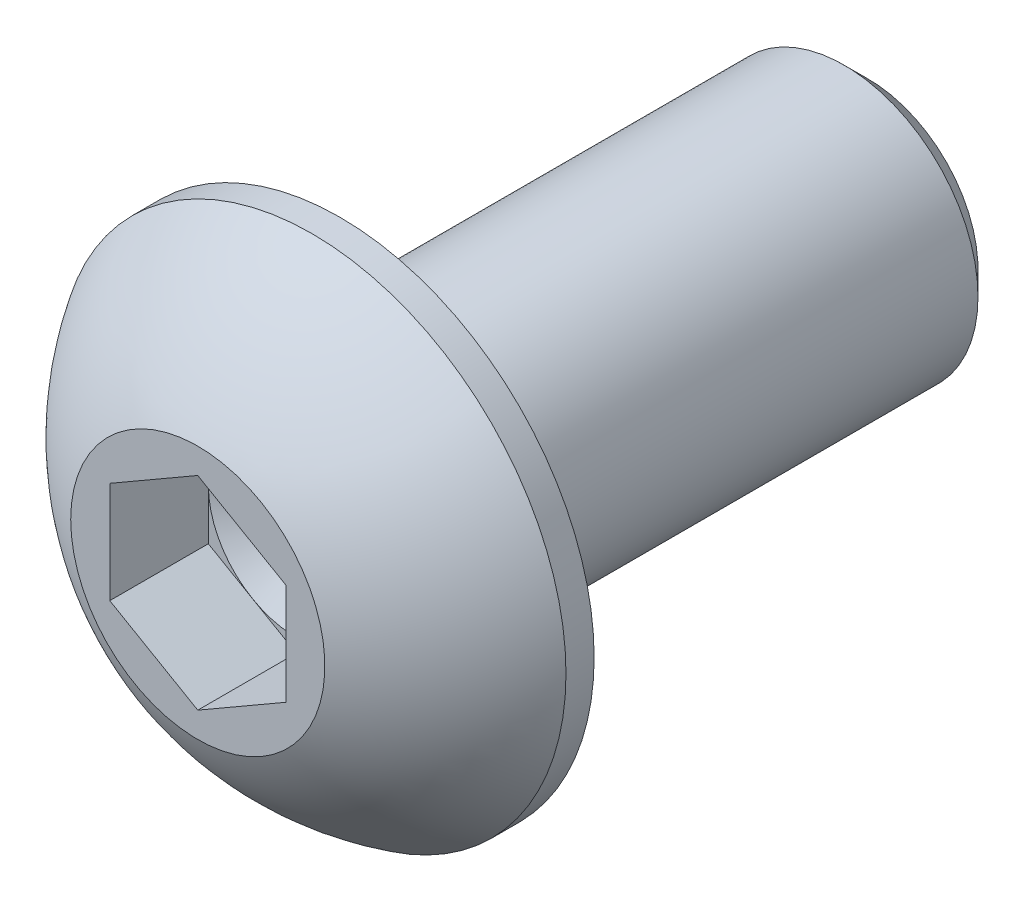
ISO-10303-21;
HEADER;
FILE_DESCRIPTION(('STEP AP214'),'2;1');
FILE_NAME('part.step','',(''),(''),'','','');
FILE_SCHEMA(('AUTOMOTIVE_DESIGN { 1 0 10303 214 1 1 1 1 }'));
ENDSEC;
DATA;
#1=APPLICATION_CONTEXT('core data for automotive mechanical design processes');
#2=APPLICATION_PROTOCOL_DEFINITION('international standard','automotive_design',2000,#1);
#3=PRODUCT_CONTEXT('',#1,'mechanical');
#4=PRODUCT('Part','Part','',(#3));
#5=PRODUCT_RELATED_PRODUCT_CATEGORY('part','',(#4));
#6=PRODUCT_DEFINITION_FORMATION('','',#4);
#7=PRODUCT_DEFINITION_CONTEXT('part definition',#1,'design');
#8=PRODUCT_DEFINITION('design','',#6,#7);
#9=PRODUCT_DEFINITION_SHAPE('','',#8);
#10=(LENGTH_UNIT() NAMED_UNIT(*) SI_UNIT(.MILLI.,.METRE.));
#11=(NAMED_UNIT(*) PLANE_ANGLE_UNIT() SI_UNIT($,.RADIAN.));
#12=(NAMED_UNIT(*) SI_UNIT($,.STERADIAN.) SOLID_ANGLE_UNIT());
#13=UNCERTAINTY_MEASURE_WITH_UNIT(LENGTH_MEASURE(1.E-05),#10,'distance_accuracy_value','');
#14=(GEOMETRIC_REPRESENTATION_CONTEXT(3) GLOBAL_UNCERTAINTY_ASSIGNED_CONTEXT((#13)) GLOBAL_UNIT_ASSIGNED_CONTEXT((#10,
#11,#12)) REPRESENTATION_CONTEXT('',''));
#15=CARTESIAN_POINT('',(0.,0.,0.));
#16=DIRECTION('',(0.,0.,1.));
#17=DIRECTION('',(1.,0.,0.));
#18=AXIS2_PLACEMENT_3D('',#15,#16,#17);
#19=CARTESIAN_POINT('',(0.,0.,-1.778));
#20=DIRECTION('',(0.,0.,1.));
#21=DIRECTION('',(1.,0.,0.));
#22=AXIS2_PLACEMENT_3D('',#19,#20,#21);
#23=PLANE('',#22);
#24=CARTESIAN_POINT('',(0.,0.,-1.778));
#25=DIRECTION('',(0.,0.,1.));
#26=DIRECTION('',(1.,0.,0.));
#27=AXIS2_PLACEMENT_3D('',#24,#25,#26);
#28=CIRCLE('',#27,1.5875);
#29=CARTESIAN_POINT('',(1.5875,0.,-1.778));
#30=VERTEX_POINT('',#29);
#31=CARTESIAN_POINT('',(0.79375,1.3748153285078,-1.778));
#32=VERTEX_POINT('',#31);
#33=EDGE_CURVE('E96',#30,#32,#28,.T.);
#34=ORIENTED_EDGE('',*,*,#33,.F.);
#35=DIRECTION('',(0.,-1.,0.));
#36=VECTOR('',#35,1.);
#37=CARTESIAN_POINT('',(1.5875,0.,-1.778));
#38=LINE('',#37,#36);
#39=CARTESIAN_POINT('',(1.5875,0.916543552338531,-1.778));
#40=VERTEX_POINT('',#39);
#41=EDGE_CURVE('E120',#40,#30,#38,.T.);
#42=ORIENTED_EDGE('',*,*,#41,.F.);
#43=DIRECTION('',(0.866025403784438,-0.5,0.));
#44=VECTOR('',#43,1.);
#45=CARTESIAN_POINT('',(0.79375,1.3748153285078,-1.778));
#46=LINE('',#45,#44);
#47=EDGE_CURVE('E118',#32,#40,#46,.T.);
#48=ORIENTED_EDGE('',*,*,#47,.F.);
#49=EDGE_LOOP('',(#34,#42,#48));
#50=FACE_BOUND('',#49,.T.);
#51=ADVANCED_FACE('F17',(#50),#23,.T.);
#52=CARTESIAN_POINT('',(-0.79375,1.37481532850779,-1.778));
#53=VERTEX_POINT('',#52);
#54=EDGE_CURVE('E98',#32,#53,#28,.T.);
#55=ORIENTED_EDGE('',*,*,#54,.F.);
#56=CARTESIAN_POINT('',(0.,1.83308710467706,-1.778));
#57=VERTEX_POINT('',#56);
#58=EDGE_CURVE('E113',#57,#32,#46,.T.);
#59=ORIENTED_EDGE('',*,*,#58,.F.);
#60=DIRECTION('',(0.866025403784437,0.5,0.));
#61=VECTOR('',#60,1.);
#62=CARTESIAN_POINT('',(-0.79375,1.37481532850779,-1.778));
#63=LINE('',#62,#61);
#64=EDGE_CURVE('E114',#53,#57,#63,.T.);
#65=ORIENTED_EDGE('',*,*,#64,.F.);
#66=EDGE_LOOP('',(#55,#59,#65));
#67=FACE_BOUND('',#66,.T.);
#68=ADVANCED_FACE('F111',(#67),#23,.T.);
#69=CARTESIAN_POINT('',(-1.5875,0.,-1.778));
#70=VERTEX_POINT('',#69);
#71=EDGE_CURVE('E117',#53,#70,#28,.T.);
#72=ORIENTED_EDGE('',*,*,#71,.F.);
#73=CARTESIAN_POINT('',(-1.5875,0.916543552338527,-1.778));
#74=VERTEX_POINT('',#73);
#75=EDGE_CURVE('E135',#74,#53,#63,.T.);
#76=ORIENTED_EDGE('',*,*,#75,.F.);
#77=DIRECTION('',(0.,1.,0.));
#78=VECTOR('',#77,1.);
#79=CARTESIAN_POINT('',(-1.5875,0.,-1.778));
#80=LINE('',#79,#78);
#81=EDGE_CURVE('E139',#70,#74,#80,.T.);
#82=ORIENTED_EDGE('',*,*,#81,.F.);
#83=EDGE_LOOP('',(#72,#76,#82));
#84=FACE_BOUND('',#83,.T.);
#85=ADVANCED_FACE('F227',(#84),#23,.T.);
#86=CARTESIAN_POINT('',(-0.79375,-1.3748153285078,-1.778));
#87=VERTEX_POINT('',#86);
#88=EDGE_CURVE('E252',#70,#87,#28,.T.);
#89=ORIENTED_EDGE('',*,*,#88,.F.);
#90=CARTESIAN_POINT('',(-1.5875,-0.916543552338531,-1.778));
#91=VERTEX_POINT('',#90);
#92=EDGE_CURVE('E140',#91,#70,#80,.T.);
#93=ORIENTED_EDGE('',*,*,#92,.F.);
#94=DIRECTION('',(-0.866025403784438,0.5,0.));
#95=VECTOR('',#94,1.);
#96=CARTESIAN_POINT('',(-0.79375,-1.3748153285078,-1.778));
#97=LINE('',#96,#95);
#98=EDGE_CURVE('E144',#87,#91,#97,.T.);
#99=ORIENTED_EDGE('',*,*,#98,.F.);
#100=EDGE_LOOP('',(#89,#93,#99));
#101=FACE_BOUND('',#100,.T.);
#102=ADVANCED_FACE('F239',(#101),#23,.T.);
#103=CARTESIAN_POINT('',(0.79375,-1.37481532850779,-1.778));
#104=VERTEX_POINT('',#103);
#105=EDGE_CURVE('E33',#87,#104,#28,.T.);
#106=ORIENTED_EDGE('',*,*,#105,.F.);
#107=CARTESIAN_POINT('',(0.,-1.83308710467706,-1.778));
#108=VERTEX_POINT('',#107);
#109=EDGE_CURVE('E145',#108,#87,#97,.T.);
#110=ORIENTED_EDGE('',*,*,#109,.F.);
#111=DIRECTION('',(-0.866025403784437,-0.5,0.));
#112=VECTOR('',#111,1.);
#113=CARTESIAN_POINT('',(0.79375,-1.37481532850779,-1.778));
#114=LINE('',#113,#112);
#115=EDGE_CURVE('E149',#104,#108,#114,.T.);
#116=ORIENTED_EDGE('',*,*,#115,.F.);
#117=EDGE_LOOP('',(#106,#110,#116));
#118=FACE_BOUND('',#117,.T.);
#119=ADVANCED_FACE('F232',(#118),#23,.T.);
#120=CARTESIAN_POINT('',(-1.146175,0.,0.));
#121=DIRECTION('',(0.,0.,1.));
#122=DIRECTION('',(1.,0.,0.));
#123=AXIS2_PLACEMENT_3D('',#120,#121,#122);
#124=PLANE('',#123);
#125=CARTESIAN_POINT('',(0.,0.,0.));
#126=DIRECTION('',(0.,0.,-1.));
#127=DIRECTION('',(-1.,0.,0.));
#128=AXIS2_PLACEMENT_3D('',#125,#126,#127);
#129=CIRCLE('',#128,2.29235);
#130=CARTESIAN_POINT('',(-2.29235000000001,0.,0.));
#131=VERTEX_POINT('',#130);
#132=EDGE_CURVE('E197',#131,#131,#129,.T.);
#133=ORIENTED_EDGE('',*,*,#132,.F.);
#134=EDGE_LOOP('',(#133));
#135=FACE_BOUND('',#134,.T.);
#136=DIRECTION('',(0.866025403784437,0.5,0.));
#137=VECTOR('',#136,1.);
#138=CARTESIAN_POINT('',(-0.79375,1.37481532850779,0.));
#139=LINE('',#138,#137);
#140=CARTESIAN_POINT('',(-1.5875,0.916543552338527,0.));
#141=VERTEX_POINT('',#140);
#142=CARTESIAN_POINT('',(0.,1.83308710467706,0.));
#143=VERTEX_POINT('',#142);
#144=EDGE_CURVE('E160',#141,#143,#139,.T.);
#145=ORIENTED_EDGE('',*,*,#144,.T.);
#146=DIRECTION('',(0.866025403784438,-0.5,0.));
#147=VECTOR('',#146,1.);
#148=CARTESIAN_POINT('',(0.79375,1.3748153285078,0.));
#149=LINE('',#148,#147);
#150=CARTESIAN_POINT('',(1.5875,0.916543552338531,0.));
#151=VERTEX_POINT('',#150);
#152=EDGE_CURVE('E106',#143,#151,#149,.T.);
#153=ORIENTED_EDGE('',*,*,#152,.T.);
#154=DIRECTION('',(0.,-1.,0.));
#155=VECTOR('',#154,1.);
#156=CARTESIAN_POINT('',(1.5875,0.,0.));
#157=LINE('',#156,#155);
#158=CARTESIAN_POINT('',(1.5875,-0.916543552338531,0.));
#159=VERTEX_POINT('',#158);
#160=EDGE_CURVE('E124',#151,#159,#157,.T.);
#161=ORIENTED_EDGE('',*,*,#160,.T.);
#162=DIRECTION('',(-0.866025403784437,-0.5,0.));
#163=VECTOR('',#162,1.);
#164=CARTESIAN_POINT('',(0.79375,-1.37481532850779,0.));
#165=LINE('',#164,#163);
#166=CARTESIAN_POINT('',(0.,-1.83308710467706,0.));
#167=VERTEX_POINT('',#166);
#168=EDGE_CURVE('E41',#159,#167,#165,.T.);
#169=ORIENTED_EDGE('',*,*,#168,.T.);
#170=DIRECTION('',(-0.866025403784438,0.5,0.));
#171=VECTOR('',#170,1.);
#172=CARTESIAN_POINT('',(-0.79375,-1.3748153285078,0.));
#173=LINE('',#172,#171);
#174=CARTESIAN_POINT('',(-1.5875,-0.916543552338531,0.));
#175=VERTEX_POINT('',#174);
#176=EDGE_CURVE('E168',#167,#175,#173,.T.);
#177=ORIENTED_EDGE('',*,*,#176,.T.);
#178=DIRECTION('',(0.,1.,0.));
#179=VECTOR('',#178,1.);
#180=CARTESIAN_POINT('',(-1.5875,0.,0.));
#181=LINE('',#180,#179);
#182=EDGE_CURVE('E164',#175,#141,#181,.T.);
#183=ORIENTED_EDGE('',*,*,#182,.T.);
#184=EDGE_LOOP('',(#145,#153,#161,#169,#177,#183));
#185=FACE_BOUND('',#184,.T.);
#186=ADVANCED_FACE('F238',(#135,#185),#124,.T.);
#187=CARTESIAN_POINT('',(0.,0.,1.48381805047393));
#188=DIRECTION('',(0.,0.,-1.));
#189=DIRECTION('',(-1.,0.,0.));
#190=AXIS2_PLACEMENT_3D('',#187,#188,#189);
#191=CYLINDRICAL_SURFACE('',#190,4.5847);
#192=CARTESIAN_POINT('',(0.,0.,-2.0574));
#193=DIRECTION('',(0.,0.,-1.));
#194=DIRECTION('',(-1.,0.,0.));
#195=AXIS2_PLACEMENT_3D('',#192,#193,#194);
#196=CIRCLE('',#195,4.5847);
#197=CARTESIAN_POINT('',(-4.5847,0.,-2.0574));
#198=VERTEX_POINT('',#197);
#199=EDGE_CURVE('E193',#198,#198,#196,.T.);
#200=ORIENTED_EDGE('',*,*,#199,.T.);
#201=EDGE_LOOP('',(#200));
#202=FACE_BOUND('',#201,.T.);
#203=CARTESIAN_POINT('',(0.,0.,-2.5654));
#204=DIRECTION('',(0.,0.,-1.));
#205=DIRECTION('',(-1.,0.,0.));
#206=AXIS2_PLACEMENT_3D('',#203,#204,#205);
#207=CIRCLE('',#206,4.5847);
#208=CARTESIAN_POINT('',(-4.5847,0.,-2.5654));
#209=VERTEX_POINT('',#208);
#210=EDGE_CURVE('E209',#209,#209,#207,.T.);
#211=ORIENTED_EDGE('',*,*,#210,.F.);
#212=EDGE_LOOP('',(#211));
#213=FACE_BOUND('',#212,.T.);
#214=ADVANCED_FACE('F244',(#202,#213),#191,.T.);
#215=CARTESIAN_POINT('',(-3.68935,0.,-2.5654));
#216=DIRECTION('',(0.,0.,-1.));
#217=DIRECTION('',(-1.,0.,0.));
#218=AXIS2_PLACEMENT_3D('',#215,#216,#217);
#219=PLANE('',#218);
#220=ORIENTED_EDGE('',*,*,#210,.T.);
#221=EDGE_LOOP('',(#220));
#222=FACE_BOUND('',#221,.T.);
#223=CARTESIAN_POINT('',(0.,0.,-2.5654));
#224=DIRECTION('',(0.,0.,-1.));
#225=DIRECTION('',(-1.,0.,0.));
#226=AXIS2_PLACEMENT_3D('',#223,#224,#225);
#227=CIRCLE('',#226,2.794);
#228=CARTESIAN_POINT('',(-2.794,0.,-2.5654));
#229=VERTEX_POINT('',#228);
#230=EDGE_CURVE('E205',#229,#229,#227,.T.);
#231=ORIENTED_EDGE('',*,*,#230,.F.);
#232=EDGE_LOOP('',(#231));
#233=FACE_BOUND('',#232,.T.);
#234=ADVANCED_FACE('F310',(#222,#233),#219,.T.);
#235=CARTESIAN_POINT('',(0.,0.,-2.9464));
#236=DIRECTION('',(0.,0.,-1.));
#237=DIRECTION('',(-1.,0.,0.));
#238=AXIS2_PLACEMENT_3D('',#235,#236,#237);
#239=TOROIDAL_SURFACE('',#238,2.794,0.381);
#240=ORIENTED_EDGE('',*,*,#230,.T.);
#241=EDGE_LOOP('',(#240));
#242=FACE_BOUND('',#241,.T.);
#243=CARTESIAN_POINT('',(0.,0.,-2.9464));
#244=DIRECTION('',(0.,0.,-1.));
#245=DIRECTION('',(-1.,0.,0.));
#246=AXIS2_PLACEMENT_3D('',#243,#244,#245);
#247=CIRCLE('',#246,2.413);
#248=CARTESIAN_POINT('',(-2.413,0.,-2.9464));
#249=VERTEX_POINT('',#248);
#250=EDGE_CURVE('E201',#249,#249,#247,.T.);
#251=ORIENTED_EDGE('',*,*,#250,.F.);
#252=EDGE_LOOP('',(#251));
#253=FACE_BOUND('',#252,.T.);
#254=ADVANCED_FACE('F318',(#242,#253),#239,.F.);
#255=CARTESIAN_POINT('',(0.,0.,1.48381805047393));
#256=DIRECTION('',(0.,0.,-1.));
#257=DIRECTION('',(-1.,0.,0.));
#258=AXIS2_PLACEMENT_3D('',#255,#256,#257);
#259=CYLINDRICAL_SURFACE('',#258,2.413);
#260=CARTESIAN_POINT('',(0.,0.,-11.66145761938));
#261=DIRECTION('',(0.,0.,-1.));
#262=DIRECTION('',(-1.,0.,0.));
#263=AXIS2_PLACEMENT_3D('',#260,#261,#262);
#264=CIRCLE('',#263,2.413);
#265=CARTESIAN_POINT('',(-2.413,0.,-11.66145761938));
#266=VERTEX_POINT('',#265);
#267=EDGE_CURVE('E11',#266,#266,#264,.F.);
#268=ORIENTED_EDGE('',*,*,#267,.T.);
#269=EDGE_LOOP('',(#268));
#270=FACE_BOUND('',#269,.T.);
#271=ORIENTED_EDGE('',*,*,#250,.T.);
#272=EDGE_LOOP('',(#271));
#273=FACE_BOUND('',#272,.T.);
#274=ADVANCED_FACE('F327',(#270,#273),#259,.T.);
#275=CARTESIAN_POINT('',(-1.2065,0.,-12.0904));
#276=DIRECTION('',(0.,0.,-1.));
#277=DIRECTION('',(-1.,0.,0.));
#278=AXIS2_PLACEMENT_3D('',#275,#276,#277);
#279=PLANE('',#278);
#280=CARTESIAN_POINT('',(0.,0.,-12.0904));
#281=DIRECTION('',(0.,0.,-1.));
#282=DIRECTION('',(-1.,0.,0.));
#283=AXIS2_PLACEMENT_3D('',#280,#281,#282);
#284=CIRCLE('',#283,1.98405761938);
#285=CARTESIAN_POINT('',(-1.98405761938,0.,-12.0904));
#286=VERTEX_POINT('',#285);
#287=EDGE_CURVE('E26',#286,#286,#284,.T.);
#288=ORIENTED_EDGE('',*,*,#287,.T.);
#289=EDGE_LOOP('',(#288));
#290=FACE_BOUND('',#289,.T.);
#291=ADVANCED_FACE('F216',(#290),#279,.T.);
#292=CARTESIAN_POINT('',(0.,0.,-4.85989606481481));
#293=DIRECTION('',(0.,0.,-1.));
#294=DIRECTION('',(-1.,0.,0.));
#295=AXIS2_PLACEMENT_3D('',#292,#293,#294);
#296=SPHERICAL_SURFACE('',#295,5.37340285883187);
#297=CARTESIAN_POINT('',(-4.5847,0.,-2.0574));
#298=CARTESIAN_POINT('',(-4.56772775071365,0.,-2.02963444466225));
#299=CARTESIAN_POINT('',(-4.55050321576171,0.,-2.00202310563314));
#300=CARTESIAN_POINT('',(-4.51555538986232,0.,-1.94711789153313));
#301=CARTESIAN_POINT('',(-4.49783209891487,0.,-1.91982401646224));
#302=CARTESIAN_POINT('',(-4.4618925763601,0.,-1.8655627616196));
#303=CARTESIAN_POINT('',(-4.44367634475278,0.,-1.83859538184787));
#304=CARTESIAN_POINT('',(-4.40675696303686,0.,-1.78499601309644));
#305=CARTESIAN_POINT('',(-4.38805381292827,0.,-1.75836402411674));
#306=CARTESIAN_POINT('',(-4.35016676527117,0.,-1.70544422925954));
#307=CARTESIAN_POINT('',(-4.33098286772266,0.,-1.67915642338203));
#308=CARTESIAN_POINT('',(-4.29214065809995,0.,-1.62693367141508));
#309=CARTESIAN_POINT('',(-4.27248234602574,0.,-1.60099872532564));
#310=CARTESIAN_POINT('',(-4.23269779601254,0.,-1.54949025368841));
#311=CARTESIAN_POINT('',(-4.21257155807355,0.,-1.52391672814064));
#312=CARTESIAN_POINT('',(-4.17185779967265,0.,-1.4731395388975));
#313=CARTESIAN_POINT('',(-4.15127027921075,0.,-1.44793587520214));
#314=CARTESIAN_POINT('',(-4.10964075130566,0.,-1.39790672892889));
#315=CARTESIAN_POINT('',(-4.08859874386249,0.,-1.37308124635099));
#316=CARTESIAN_POINT('',(-4.04606718757048,0.,-1.32381665673685));
#317=CARTESIAN_POINT('',(-4.02457763872164,0.,-1.29937754970059));
#318=CARTESIAN_POINT('',(-3.98115809291457,0.,-1.25089377806135));
#319=CARTESIAN_POINT('',(-3.95922809595633,0.,-1.22684911345837));
#320=CARTESIAN_POINT('',(-3.91493489261154,0.,-1.1791621633785));
#321=CARTESIAN_POINT('',(-3.892571686225,0.,-1.15551987790161));
#322=CARTESIAN_POINT('',(-3.84741944569869,0.,-1.10864548994917));
#323=CARTESIAN_POINT('',(-3.82463041155893,0.,-1.08541338747362));
#324=CARTESIAN_POINT('',(-3.77863403775912,0.,-1.03936703400529));
#325=CARTESIAN_POINT('',(-3.75542669809908,0.,-1.01655278301252));
#326=CARTESIAN_POINT('',(-3.70860137356642,0.,-0.971349663066289));
#327=CARTESIAN_POINT('',(-3.68498338869382,0.,-0.94896079411283));
#328=CARTESIAN_POINT('',(-3.63734456959005,0.,-0.904615828391113));
#329=CARTESIAN_POINT('',(-3.61332373535889,0.,-0.882659731622856));
#330=CARTESIAN_POINT('',(-3.56488714636506,0.,-0.839187557567447));
#331=CARTESIAN_POINT('',(-3.54047139160238,0.,-0.817671480280295));
#332=CARTESIAN_POINT('',(-3.4912530207284,0.,-0.775086447240822));
#333=CARTESIAN_POINT('',(-3.4664504046171,0.,-0.754017491488501));
#334=CARTESIAN_POINT('',(-3.41646649792444,0.,-0.712333655985979));
#335=CARTESIAN_POINT('',(-3.39128520734309,0.,-0.691718776235777));
#336=CARTESIAN_POINT('',(-3.34055226358225,0.,-0.650949897322802));
#337=CARTESIAN_POINT('',(-3.31500061040276,0.,-0.630795898160027));
#338=CARTESIAN_POINT('',(-3.26353537556731,0.,-0.590955432879197));
#339=CARTESIAN_POINT('',(-3.23762179391134,0.,-0.57126896676114));
#340=CARTESIAN_POINT('',(-3.18544125571044,0.,-0.532370065703055));
#341=CARTESIAN_POINT('',(-3.15917429916551,0.,-0.513157630763025));
#342=CARTESIAN_POINT('',(-3.10629568141643,0.,-0.475213133725829));
#343=CARTESIAN_POINT('',(-3.07968402021229,0.,-0.456481071628663));
#344=CARTESIAN_POINT('',(-3.02612477715573,0.,-0.419503503378719));
#345=CARTESIAN_POINT('',(-2.99917719530331,0.,-0.40125799722594));
#346=CARTESIAN_POINT('',(-2.94495500583993,0.,-0.365259563367945));
#347=CARTESIAN_POINT('',(-2.91768039822897,0.,-0.347506635662729));
#348=CARTESIAN_POINT('',(-2.8628131600919,0.,-0.312499218594777));
#349=CARTESIAN_POINT('',(-2.83522052956579,0.,-0.295244729232041));
#350=CARTESIAN_POINT('',(-2.77972635338319,0.,-0.261239884283562));
#351=CARTESIAN_POINT('',(-2.75182480772671,0.,-0.244489528697819));
#352=CARTESIAN_POINT('',(-2.69572201115466,0.,-0.211498480091079));
#353=CARTESIAN_POINT('',(-2.6675207602391,0.,-0.195257787070081));
#354=CARTESIAN_POINT('',(-2.61082786150165,0.,-0.163291425052401));
#355=CARTESIAN_POINT('',(-2.58233621367977,0.,-0.147565756055718));
#356=CARTESIAN_POINT('',(-2.52507192700006,0.,-0.116634630180611));
#357=CARTESIAN_POINT('',(-2.49629928814224,0.,-0.101429173302187));
#358=CARTESIAN_POINT('',(-2.43848251180434,0.,-0.0715435006068001));
#359=CARTESIAN_POINT('',(-2.40943837432427,0.,-0.0568632847898376));
#360=CARTESIAN_POINT('',(-2.35108820593536,0.,-0.0280329029080984));
#361=CARTESIAN_POINT('',(-2.32178217502651,0.,-0.0138827368433216));
#362=CARTESIAN_POINT('',(-2.29235000000001,0.,0.));
#363=B_SPLINE_CURVE_WITH_KNOTS('',3,(#297,#298,#299,#300,#301,#302,#303,#304,#305,#306,#307,
#308,#309,#310,#311,#312,#313,#314,#315,#316,#317,#318,#319,#320,#321,#322,#323,#324,#325,#326,
#327,#328,#329,#330,#331,#332,#333,#334,#335,#336,#337,#338,#339,#340,#341,#342,#343,#344,#345,
#346,#347,#348,#349,#350,#351,#352,#353,#354,#355,#356,#357,#358,#359,#360,#361,#362),
.UNSPECIFIED.,.F.,.F.,(4,2,2,2,2,2,2,2,2,2,2,2,2,2,2,2,2,2,2,2,2,2,2,2,2,2,2,2,2,2,2,2,4),(0.,
0.09762472664678,0.195249453293559,0.292874179940339,0.390498906587117,0.488123633233897,
0.585748359880676,0.683373086527455,0.780997813174235,0.878622539821013,0.976247266467793,
1.07387199311457,1.17149671976135,1.26912144640813,1.36674617305491,1.46437089970169,
1.56199562634847,1.65962035299525,1.75724507964203,1.85486980628881,1.95249453293559,
2.05011925958237,2.14774398622914,2.24536871287592,2.3429934395227,2.44061816616948,
2.53824289281626,2.63586761946304,2.73349234610982,2.8311170727566,2.92874179940338,
3.02636652605016,3.12399125269694),.UNSPECIFIED.);
#364=EDGE_CURVE('BSEAM344',#198,#131,#363,.T.);
#365=ORIENTED_EDGE('',*,*,#199,.F.);
#366=ORIENTED_EDGE('',*,*,#132,.T.);
#367=ORIENTED_EDGE('',*,*,#364,.T.);
#368=ORIENTED_EDGE('',*,*,#364,.F.);
#369=EDGE_LOOP('',(#365,#367,#366,#368));
#370=FACE_BOUND('',#369,.T.);
#371=ADVANCED_FACE('F344',(#370),#296,.T.);
#372=CARTESIAN_POINT('',(0.79375,1.3748153285078,-1.778));
#373=DIRECTION('',(-0.5,-0.866025403784438,0.));
#374=DIRECTION('',(0.866025403784438,-0.5,0.));
#375=AXIS2_PLACEMENT_3D('',#372,#373,#374);
#376=PLANE('',#375);
#377=ORIENTED_EDGE('',*,*,#152,.F.);
#378=DIRECTION('',(0.,0.,1.));
#379=VECTOR('',#378,1.);
#380=CARTESIAN_POINT('',(0.,1.83308710467706,-1.778));
#381=LINE('',#380,#379);
#382=EDGE_CURVE('E129',#57,#143,#381,.T.);
#383=ORIENTED_EDGE('',*,*,#382,.F.);
#384=ORIENTED_EDGE('',*,*,#58,.T.);
#385=ORIENTED_EDGE('',*,*,#47,.T.);
#386=DIRECTION('',(0.,0.,1.));
#387=VECTOR('',#386,1.);
#388=CARTESIAN_POINT('',(1.5875,0.916543552338531,-1.778));
#389=LINE('',#388,#387);
#390=EDGE_CURVE('E157',#40,#151,#389,.T.);
#391=ORIENTED_EDGE('',*,*,#390,.T.);
#392=EDGE_LOOP('',(#377,#383,#384,#385,#391));
#393=FACE_BOUND('',#392,.T.);
#394=ADVANCED_FACE('F128',(#393),#376,.T.);
#395=CARTESIAN_POINT('',(-0.79375,1.37481532850779,-1.778));
#396=DIRECTION('',(0.5,-0.866025403784437,0.));
#397=DIRECTION('',(0.866025403784437,0.5,0.));
#398=AXIS2_PLACEMENT_3D('',#395,#396,#397);
#399=PLANE('',#398);
#400=ORIENTED_EDGE('',*,*,#144,.F.);
#401=DIRECTION('',(0.,0.,1.));
#402=VECTOR('',#401,1.);
#403=CARTESIAN_POINT('',(-1.5875,0.916543552338527,-1.778));
#404=LINE('',#403,#402);
#405=EDGE_CURVE('E188',#74,#141,#404,.T.);
#406=ORIENTED_EDGE('',*,*,#405,.F.);
#407=ORIENTED_EDGE('',*,*,#75,.T.);
#408=ORIENTED_EDGE('',*,*,#64,.T.);
#409=ORIENTED_EDGE('',*,*,#382,.T.);
#410=EDGE_LOOP('',(#400,#406,#407,#408,#409));
#411=FACE_BOUND('',#410,.T.);
#412=ADVANCED_FACE('F278',(#411),#399,.T.);
#413=CARTESIAN_POINT('',(-1.5875,0.,-1.778));
#414=DIRECTION('',(1.,0.,0.));
#415=DIRECTION('',(0.,0.,-1.));
#416=AXIS2_PLACEMENT_3D('',#413,#414,#415);
#417=PLANE('',#416);
#418=ORIENTED_EDGE('',*,*,#182,.F.);
#419=DIRECTION('',(0.,0.,1.));
#420=VECTOR('',#419,1.);
#421=CARTESIAN_POINT('',(-1.5875,-0.916543552338531,-1.778));
#422=LINE('',#421,#420);
#423=EDGE_CURVE('E185',#91,#175,#422,.T.);
#424=ORIENTED_EDGE('',*,*,#423,.F.);
#425=ORIENTED_EDGE('',*,*,#92,.T.);
#426=ORIENTED_EDGE('',*,*,#81,.T.);
#427=ORIENTED_EDGE('',*,*,#405,.T.);
#428=EDGE_LOOP('',(#418,#424,#425,#426,#427));
#429=FACE_BOUND('',#428,.T.);
#430=ADVANCED_FACE('F273',(#429),#417,.T.);
#431=CARTESIAN_POINT('',(-0.79375,-1.3748153285078,-1.778));
#432=DIRECTION('',(0.5,0.866025403784438,0.));
#433=DIRECTION('',(-0.866025403784438,0.5,0.));
#434=AXIS2_PLACEMENT_3D('',#431,#432,#433);
#435=PLANE('',#434);
#436=ORIENTED_EDGE('',*,*,#176,.F.);
#437=DIRECTION('',(0.,0.,1.));
#438=VECTOR('',#437,1.);
#439=CARTESIAN_POINT('',(0.,-1.83308710467706,-1.778));
#440=LINE('',#439,#438);
#441=EDGE_CURVE('E182',#108,#167,#440,.T.);
#442=ORIENTED_EDGE('',*,*,#441,.F.);
#443=ORIENTED_EDGE('',*,*,#109,.T.);
#444=ORIENTED_EDGE('',*,*,#98,.T.);
#445=ORIENTED_EDGE('',*,*,#423,.T.);
#446=EDGE_LOOP('',(#436,#442,#443,#444,#445));
#447=FACE_BOUND('',#446,.T.);
#448=ADVANCED_FACE('F261',(#447),#435,.T.);
#449=CARTESIAN_POINT('',(0.79375,-1.37481532850779,-1.778));
#450=DIRECTION('',(-0.5,0.866025403784437,0.));
#451=DIRECTION('',(-0.866025403784437,-0.5,0.));
#452=AXIS2_PLACEMENT_3D('',#449,#450,#451);
#453=PLANE('',#452);
#454=ORIENTED_EDGE('',*,*,#168,.F.);
#455=DIRECTION('',(0.,0.,1.));
#456=VECTOR('',#455,1.);
#457=CARTESIAN_POINT('',(1.5875,-0.916543552338531,-1.778));
#458=LINE('',#457,#456);
#459=CARTESIAN_POINT('',(1.5875,-0.916543552338531,-1.778));
#460=VERTEX_POINT('',#459);
#461=EDGE_CURVE('E179',#460,#159,#458,.T.);
#462=ORIENTED_EDGE('',*,*,#461,.F.);
#463=EDGE_CURVE('E150',#460,#104,#114,.T.);
#464=ORIENTED_EDGE('',*,*,#463,.T.);
#465=ORIENTED_EDGE('',*,*,#115,.T.);
#466=ORIENTED_EDGE('',*,*,#441,.T.);
#467=EDGE_LOOP('',(#454,#462,#464,#465,#466));
#468=FACE_BOUND('',#467,.T.);
#469=ADVANCED_FACE('F235',(#468),#453,.T.);
#470=CARTESIAN_POINT('',(1.5875,0.,-1.778));
#471=DIRECTION('',(-1.,0.,0.));
#472=DIRECTION('',(0.,0.,1.));
#473=AXIS2_PLACEMENT_3D('',#470,#471,#472);
#474=PLANE('',#473);
#475=ORIENTED_EDGE('',*,*,#160,.F.);
#476=ORIENTED_EDGE('',*,*,#390,.F.);
#477=ORIENTED_EDGE('',*,*,#41,.T.);
#478=EDGE_CURVE('E154',#30,#460,#38,.T.);
#479=ORIENTED_EDGE('',*,*,#478,.T.);
#480=ORIENTED_EDGE('',*,*,#461,.T.);
#481=EDGE_LOOP('',(#475,#476,#477,#479,#480));
#482=FACE_BOUND('',#481,.T.);
#483=ADVANCED_FACE('F230',(#482),#474,.T.);
#484=EDGE_CURVE('E100',#104,#30,#28,.T.);
#485=ORIENTED_EDGE('',*,*,#484,.F.);
#486=ORIENTED_EDGE('',*,*,#463,.F.);
#487=ORIENTED_EDGE('',*,*,#478,.F.);
#488=EDGE_LOOP('',(#485,#486,#487));
#489=FACE_BOUND('',#488,.T.);
#490=ADVANCED_FACE('F93',(#489),#23,.T.);
#491=CARTESIAN_POINT('',(0.,0.,-1.778));
#492=DIRECTION('',(0.,0.,1.));
#493=DIRECTION('',(1.,0.,0.));
#494=AXIS2_PLACEMENT_3D('',#491,#492,#493);
#495=CONICAL_SURFACE('',#494,1.5875,1.0471975511966);
#496=CARTESIAN_POINT('',(0.,0.,-2.69454355233854));
#497=VERTEX_POINT('',#496);
#498=VERTEX_LOOP('',#497);
#499=FACE_BOUND('',#498,.T.);
#500=ORIENTED_EDGE('',*,*,#33,.T.);
#501=ORIENTED_EDGE('',*,*,#54,.T.);
#502=ORIENTED_EDGE('',*,*,#71,.T.);
#503=ORIENTED_EDGE('',*,*,#88,.T.);
#504=ORIENTED_EDGE('',*,*,#105,.T.);
#505=ORIENTED_EDGE('',*,*,#484,.T.);
#506=EDGE_LOOP('',(#500,#501,#502,#503,#504,#505));
#507=FACE_BOUND('',#506,.T.);
#508=ADVANCED_FACE('F91',(#499,#507),#495,.F.);
#509=CARTESIAN_POINT('',(0.,0.,-12.0904));
#510=DIRECTION('',(0.,0.,1.));
#511=DIRECTION('',(1.,0.,0.));
#512=AXIS2_PLACEMENT_3D('',#509,#510,#511);
#513=CONICAL_SURFACE('',#512,1.98405761938,0.785398163397448);
#514=ORIENTED_EDGE('',*,*,#267,.F.);
#515=EDGE_LOOP('',(#514));
#516=FACE_BOUND('',#515,.T.);
#517=ORIENTED_EDGE('',*,*,#287,.F.);
#518=EDGE_LOOP('',(#517));
#519=FACE_BOUND('',#518,.T.);
#520=ADVANCED_FACE('F19',(#516,#519),#513,.T.);
#521=CLOSED_SHELL('',(#51,#68,#85,#102,#119,#186,#214,#234,#254,#274,#291,#371,#394,#412,#430,
#448,#469,#483,#490,#508,#520));
#522=MANIFOLD_SOLID_BREP('B1',#521);
#523=ADVANCED_BREP_SHAPE_REPRESENTATION('',(#18,#522),#14);
#524=SHAPE_DEFINITION_REPRESENTATION(#9,#523);
ENDSEC;
END-ISO-10303-21;
